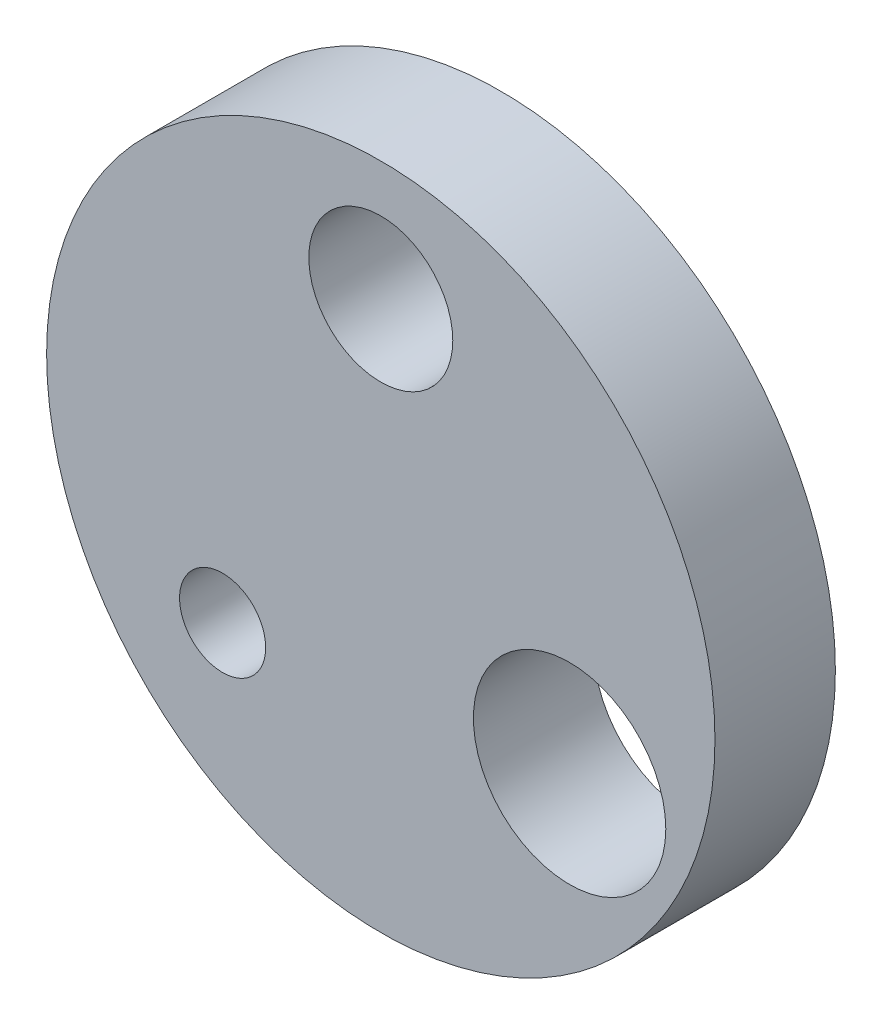
ISO-10303-21;
HEADER;
FILE_DESCRIPTION(('STEP AP214'),'2;1');
FILE_NAME('part.step','',(''),(''),'','','');
FILE_SCHEMA(('AUTOMOTIVE_DESIGN { 1 0 10303 214 1 1 1 1 }'));
ENDSEC;
DATA;
#1=APPLICATION_CONTEXT('core data for automotive mechanical design processes');
#2=APPLICATION_PROTOCOL_DEFINITION('international standard','automotive_design',2000,#1);
#3=PRODUCT_CONTEXT('',#1,'mechanical');
#4=PRODUCT('Part','Part','',(#3));
#5=PRODUCT_RELATED_PRODUCT_CATEGORY('part','',(#4));
#6=PRODUCT_DEFINITION_FORMATION('','',#4);
#7=PRODUCT_DEFINITION_CONTEXT('part definition',#1,'design');
#8=PRODUCT_DEFINITION('design','',#6,#7);
#9=PRODUCT_DEFINITION_SHAPE('','',#8);
#10=(LENGTH_UNIT() NAMED_UNIT(*) SI_UNIT(.MILLI.,.METRE.));
#11=(NAMED_UNIT(*) PLANE_ANGLE_UNIT() SI_UNIT($,.RADIAN.));
#12=(NAMED_UNIT(*) SI_UNIT($,.STERADIAN.) SOLID_ANGLE_UNIT());
#13=UNCERTAINTY_MEASURE_WITH_UNIT(LENGTH_MEASURE(1.E-05),#10,'distance_accuracy_value','');
#14=(GEOMETRIC_REPRESENTATION_CONTEXT(3) GLOBAL_UNCERTAINTY_ASSIGNED_CONTEXT((#13)) GLOBAL_UNIT_ASSIGNED_CONTEXT((#10,
#11,#12)) REPRESENTATION_CONTEXT('',''));
#15=CARTESIAN_POINT('',(0.,0.,0.));
#16=DIRECTION('',(0.,0.,1.));
#17=DIRECTION('',(1.,0.,0.));
#18=AXIS2_PLACEMENT_3D('',#15,#16,#17);
#19=CARTESIAN_POINT('',(0.,0.,20.));
#20=DIRECTION('',(0.,0.,1.));
#21=DIRECTION('',(1.,0.,0.));
#22=AXIS2_PLACEMENT_3D('',#19,#20,#21);
#23=PLANE('',#22);
#24=CARTESIAN_POINT('',(-26.2688211421867,-24.0804240268704,20.));
#25=DIRECTION('',(0.,0.,1.));
#26=DIRECTION('',(1.,0.,0.));
#27=AXIS2_PLACEMENT_3D('',#24,#25,#26);
#28=CIRCLE('',#27,7.14978492215175);
#29=CARTESIAN_POINT('',(-19.119036220035,-24.0804240268704,20.));
#30=VERTEX_POINT('',#29);
#31=EDGE_CURVE('E46',#30,#30,#28,.T.);
#32=ORIENTED_EDGE('',*,*,#31,.F.);
#33=EDGE_LOOP('',(#32));
#34=FACE_BOUND('',#33,.T.);
#35=CARTESIAN_POINT('',(0.,0.,20.));
#36=DIRECTION('',(0.,0.,1.));
#37=DIRECTION('',(1.,0.,0.));
#38=AXIS2_PLACEMENT_3D('',#35,#36,#37);
#39=CIRCLE('',#38,55.5);
#40=CARTESIAN_POINT('',(55.5,0.,20.));
#41=VERTEX_POINT('',#40);
#42=EDGE_CURVE('E10',#41,#41,#39,.T.);
#43=ORIENTED_EDGE('',*,*,#42,.T.);
#44=EDGE_LOOP('',(#43));
#45=FACE_BOUND('',#44,.T.);
#46=CARTESIAN_POINT('',(0.,35.6359058466889,20.));
#47=DIRECTION('',(0.,0.,1.));
#48=DIRECTION('',(1.,0.,0.));
#49=AXIS2_PLACEMENT_3D('',#46,#47,#48);
#50=CIRCLE('',#49,11.9552716388892);
#51=CARTESIAN_POINT('',(11.9552716388892,35.6359058466889,20.));
#52=VERTEX_POINT('',#51);
#53=EDGE_CURVE('E41',#52,#52,#50,.T.);
#54=ORIENTED_EDGE('',*,*,#53,.F.);
#55=EDGE_LOOP('',(#54));
#56=FACE_BOUND('',#55,.T.);
#57=CARTESIAN_POINT('',(31.3571562010946,-16.9306391047186,20.));
#58=DIRECTION('',(0.,0.,1.));
#59=DIRECTION('',(1.,0.,0.));
#60=AXIS2_PLACEMENT_3D('',#57,#58,#59);
#61=CIRCLE('',#60,15.9759826737907);
#62=CARTESIAN_POINT('',(47.3331388748853,-16.9306391047186,20.));
#63=VERTEX_POINT('',#62);
#64=EDGE_CURVE('E52',#63,#63,#61,.T.);
#65=ORIENTED_EDGE('',*,*,#64,.F.);
#66=EDGE_LOOP('',(#65));
#67=FACE_BOUND('',#66,.T.);
#68=ADVANCED_FACE('F30',(#34,#45,#56,#67),#23,.T.);
#69=CARTESIAN_POINT('',(0.,0.,0.));
#70=DIRECTION('',(0.,0.,1.));
#71=DIRECTION('',(1.,0.,0.));
#72=AXIS2_PLACEMENT_3D('',#69,#70,#71);
#73=PLANE('',#72);
#74=CARTESIAN_POINT('',(0.,0.,0.));
#75=DIRECTION('',(0.,0.,1.));
#76=DIRECTION('',(1.,0.,0.));
#77=AXIS2_PLACEMENT_3D('',#74,#75,#76);
#78=CIRCLE('',#77,55.5);
#79=CARTESIAN_POINT('',(55.5,0.,0.));
#80=VERTEX_POINT('',#79);
#81=EDGE_CURVE('E34',#80,#80,#78,.T.);
#82=ORIENTED_EDGE('',*,*,#81,.F.);
#83=EDGE_LOOP('',(#82));
#84=FACE_BOUND('',#83,.T.);
#85=CARTESIAN_POINT('',(0.,35.6359058466889,0.));
#86=DIRECTION('',(0.,0.,1.));
#87=DIRECTION('',(1.,0.,0.));
#88=AXIS2_PLACEMENT_3D('',#85,#86,#87);
#89=CIRCLE('',#88,11.9552716388892);
#90=CARTESIAN_POINT('',(11.9552716388892,35.6359058466889,0.));
#91=VERTEX_POINT('',#90);
#92=EDGE_CURVE('E43',#91,#91,#89,.T.);
#93=ORIENTED_EDGE('',*,*,#92,.T.);
#94=EDGE_LOOP('',(#93));
#95=FACE_BOUND('',#94,.T.);
#96=CARTESIAN_POINT('',(-26.2688211421867,-24.0804240268704,0.));
#97=DIRECTION('',(0.,0.,1.));
#98=DIRECTION('',(1.,0.,0.));
#99=AXIS2_PLACEMENT_3D('',#96,#97,#98);
#100=CIRCLE('',#99,7.14978492215175);
#101=CARTESIAN_POINT('',(-19.119036220035,-24.0804240268704,0.));
#102=VERTEX_POINT('',#101);
#103=EDGE_CURVE('E49',#102,#102,#100,.T.);
#104=ORIENTED_EDGE('',*,*,#103,.T.);
#105=EDGE_LOOP('',(#104));
#106=FACE_BOUND('',#105,.T.);
#107=CARTESIAN_POINT('',(31.3571562010946,-16.9306391047186,0.));
#108=DIRECTION('',(0.,0.,1.));
#109=DIRECTION('',(1.,0.,0.));
#110=AXIS2_PLACEMENT_3D('',#107,#108,#109);
#111=CIRCLE('',#110,15.9759826737907);
#112=CARTESIAN_POINT('',(47.3331388748853,-16.9306391047186,0.));
#113=VERTEX_POINT('',#112);
#114=EDGE_CURVE('E55',#113,#113,#111,.T.);
#115=ORIENTED_EDGE('',*,*,#114,.T.);
#116=EDGE_LOOP('',(#115));
#117=FACE_BOUND('',#116,.T.);
#118=ADVANCED_FACE('F65',(#84,#95,#106,#117),#73,.F.);
#119=CARTESIAN_POINT('',(0.,0.,20.));
#120=DIRECTION('',(0.,0.,-1.));
#121=DIRECTION('',(-1.,0.,0.));
#122=AXIS2_PLACEMENT_3D('',#119,#120,#121);
#123=CYLINDRICAL_SURFACE('',#122,55.5);
#124=ORIENTED_EDGE('',*,*,#42,.F.);
#125=EDGE_LOOP('',(#124));
#126=FACE_BOUND('',#125,.T.);
#127=ORIENTED_EDGE('',*,*,#81,.T.);
#128=EDGE_LOOP('',(#127));
#129=FACE_BOUND('',#128,.T.);
#130=ADVANCED_FACE('F32',(#126,#129),#123,.T.);
#131=CARTESIAN_POINT('',(0.,35.6359058466889,20.));
#132=DIRECTION('',(0.,0.,-1.));
#133=DIRECTION('',(-1.,0.,0.));
#134=AXIS2_PLACEMENT_3D('',#131,#132,#133);
#135=CYLINDRICAL_SURFACE('',#134,11.9552716388892);
#136=ORIENTED_EDGE('',*,*,#53,.T.);
#137=EDGE_LOOP('',(#136));
#138=FACE_BOUND('',#137,.T.);
#139=ORIENTED_EDGE('',*,*,#92,.F.);
#140=EDGE_LOOP('',(#139));
#141=FACE_BOUND('',#140,.T.);
#142=ADVANCED_FACE('F74',(#138,#141),#135,.F.);
#143=CARTESIAN_POINT('',(-26.2688211421867,-24.0804240268704,20.));
#144=DIRECTION('',(0.,0.,-1.));
#145=DIRECTION('',(-1.,0.,0.));
#146=AXIS2_PLACEMENT_3D('',#143,#144,#145);
#147=CYLINDRICAL_SURFACE('',#146,7.14978492215175);
#148=ORIENTED_EDGE('',*,*,#31,.T.);
#149=EDGE_LOOP('',(#148));
#150=FACE_BOUND('',#149,.T.);
#151=ORIENTED_EDGE('',*,*,#103,.F.);
#152=EDGE_LOOP('',(#151));
#153=FACE_BOUND('',#152,.T.);
#154=ADVANCED_FACE('F77',(#150,#153),#147,.F.);
#155=CARTESIAN_POINT('',(31.3571562010946,-16.9306391047186,20.));
#156=DIRECTION('',(0.,0.,-1.));
#157=DIRECTION('',(-1.,0.,0.));
#158=AXIS2_PLACEMENT_3D('',#155,#156,#157);
#159=CYLINDRICAL_SURFACE('',#158,15.9759826737907);
#160=ORIENTED_EDGE('',*,*,#64,.T.);
#161=EDGE_LOOP('',(#160));
#162=FACE_BOUND('',#161,.T.);
#163=ORIENTED_EDGE('',*,*,#114,.F.);
#164=EDGE_LOOP('',(#163));
#165=FACE_BOUND('',#164,.T.);
#166=ADVANCED_FACE('F61',(#162,#165),#159,.F.);
#167=CLOSED_SHELL('',(#68,#118,#130,#142,#154,#166));
#168=MANIFOLD_SOLID_BREP('B2',#167);
#169=ADVANCED_BREP_SHAPE_REPRESENTATION('',(#18,#168),#14);
#170=SHAPE_DEFINITION_REPRESENTATION(#9,#169);
ENDSEC;
END-ISO-10303-21;
